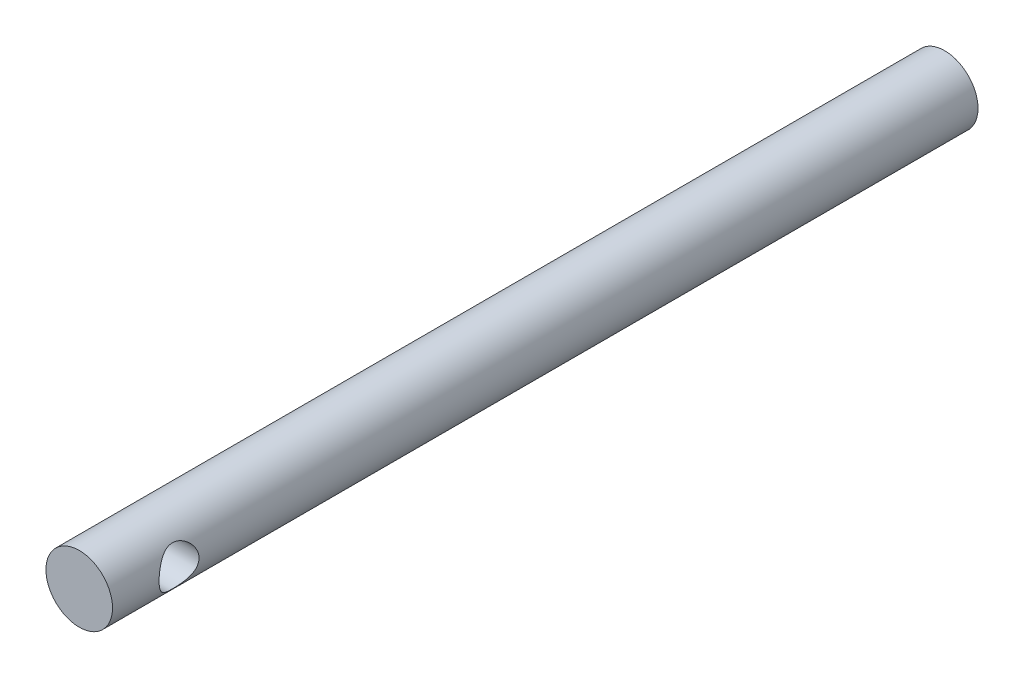
ISO-10303-21;
HEADER;
FILE_DESCRIPTION(('STEP AP214'),'2;1');
FILE_NAME('part.step','',(''),(''),'','','');
FILE_SCHEMA(('AUTOMOTIVE_DESIGN { 1 0 10303 214 1 1 1 1 }'));
ENDSEC;
DATA;
#1=APPLICATION_CONTEXT('core data for automotive mechanical design processes');
#2=APPLICATION_PROTOCOL_DEFINITION('international standard','automotive_design',2000,#1);
#3=PRODUCT_CONTEXT('',#1,'mechanical');
#4=PRODUCT('Part','Part','',(#3));
#5=PRODUCT_RELATED_PRODUCT_CATEGORY('part','',(#4));
#6=PRODUCT_DEFINITION_FORMATION('','',#4);
#7=PRODUCT_DEFINITION_CONTEXT('part definition',#1,'design');
#8=PRODUCT_DEFINITION('design','',#6,#7);
#9=PRODUCT_DEFINITION_SHAPE('','',#8);
#10=(LENGTH_UNIT() NAMED_UNIT(*) SI_UNIT(.MILLI.,.METRE.));
#11=(NAMED_UNIT(*) PLANE_ANGLE_UNIT() SI_UNIT($,.RADIAN.));
#12=(NAMED_UNIT(*) SI_UNIT($,.STERADIAN.) SOLID_ANGLE_UNIT());
#13=UNCERTAINTY_MEASURE_WITH_UNIT(LENGTH_MEASURE(1.E-05),#10,'distance_accuracy_value','');
#14=(GEOMETRIC_REPRESENTATION_CONTEXT(3) GLOBAL_UNCERTAINTY_ASSIGNED_CONTEXT((#13)) GLOBAL_UNIT_ASSIGNED_CONTEXT((#10,
#11,#12)) REPRESENTATION_CONTEXT('',''));
#15=CARTESIAN_POINT('',(0.,0.,0.));
#16=DIRECTION('',(0.,0.,1.));
#17=DIRECTION('',(1.,0.,0.));
#18=AXIS2_PLACEMENT_3D('',#15,#16,#17);
#19=CARTESIAN_POINT('',(0.,0.,-130.));
#20=DIRECTION('',(0.,0.,1.));
#21=DIRECTION('',(1.,0.,0.));
#22=AXIS2_PLACEMENT_3D('',#19,#20,#21);
#23=CYLINDRICAL_SURFACE('',#22,5.);
#24=CARTESIAN_POINT('',(-5.,0.,-13.));
#25=CARTESIAN_POINT('',(-4.99999907546385,-0.0767697294351699,-12.9999989437555));
#26=CARTESIAN_POINT('',(-4.99822567812271,-0.153562134518386,-12.9970464064299));
#27=CARTESIAN_POINT('',(-4.99118362570631,-0.306548487758714,-12.9852857670203));
#28=CARTESIAN_POINT('',(-4.98591292553957,-0.382742059346592,-12.9764742388118));
#29=CARTESIAN_POINT('',(-4.96499345352549,-0.609808130024626,-12.9413514405369));
#30=CARTESIAN_POINT('',(-4.94423772571335,-0.758981863291666,-12.9063522975666));
#31=CARTESIAN_POINT('',(-4.89123238995897,-1.04754167363585,-12.8152272564959));
#32=CARTESIAN_POINT('',(-4.8590397955111,-1.18697226741342,-12.7592060779873));
#33=CARTESIAN_POINT('',(-4.7859070225578,-1.45405042800218,-12.628279339403));
#34=CARTESIAN_POINT('',(-4.74496901614699,-1.58170090938261,-12.5533784676398));
#35=CARTESIAN_POINT('',(-4.65410731283371,-1.83260160381823,-12.3804503448849));
#36=CARTESIAN_POINT('',(-4.60373587041895,-1.95476885986166,-12.2810926088335));
#37=CARTESIAN_POINT('',(-4.50060875905921,-2.18176458748059,-12.0650655928078));
#38=CARTESIAN_POINT('',(-4.4478500955754,-2.28657046750403,-11.9483741257817));
#39=CARTESIAN_POINT('',(-4.33822134833335,-2.48890019509837,-11.6841529788311));
#40=CARTESIAN_POINT('',(-4.28164035635797,-2.5839553962784,-11.5345964578778));
#41=CARTESIAN_POINT('',(-4.17876602596121,-2.74722868670786,-11.2183068536731));
#42=CARTESIAN_POINT('',(-4.13245604474886,-2.8154903315581,-11.0516022079668));
#43=CARTESIAN_POINT('',(-4.06709259377223,-2.90881204577224,-10.7468070983431));
#44=CARTESIAN_POINT('',(-4.04415766338645,-2.94032394587637,-10.6115280016386));
#45=CARTESIAN_POINT('',(-4.01180616527622,-2.98432344587083,-10.3363925694786));
#46=CARTESIAN_POINT('',(-4.00237279089368,-2.99683469884358,-10.196542146696));
#47=CARTESIAN_POINT('',(-3.99841845126251,-3.0021101681982,-9.91597700735214));
#48=CARTESIAN_POINT('',(-4.00392674756739,-2.99483563630785,-9.77526113408813));
#49=CARTESIAN_POINT('',(-4.02906522155629,-2.96092124146105,-9.49744246488214));
#50=CARTESIAN_POINT('',(-4.04870602134773,-2.93426681225441,-9.36034246705851));
#51=CARTESIAN_POINT('',(-4.09906376582929,-2.86347831933193,-9.09493945774946));
#52=CARTESIAN_POINT('',(-4.12963433300037,-2.8195745342289,-8.96654567700555));
#53=CARTESIAN_POINT('',(-4.19854092703026,-2.71590167467071,-8.7186102333682));
#54=CARTESIAN_POINT('',(-4.2368797994146,-2.65612678414159,-8.59907183617098));
#55=CARTESIAN_POINT('',(-4.32510698365561,-2.51035773820671,-8.35003086234366));
#56=CARTESIAN_POINT('',(-4.3758426358075,-2.42160671901867,-8.22244000763227));
#57=CARTESIAN_POINT('',(-4.4786102252415,-2.22582963207776,-7.98265084277989));
#58=CARTESIAN_POINT('',(-4.53064336077653,-2.11878609335504,-7.87046743459787));
#59=CARTESIAN_POINT('',(-4.63871766962913,-1.87159040921357,-7.64875774055151));
#60=CARTESIAN_POINT('',(-4.69430681953073,-1.72890315178768,-7.54178060876265));
#61=CARTESIAN_POINT('',(-4.77018325995047,-1.50061053630278,-7.40073128727714));
#62=CARTESIAN_POINT('',(-4.79423315237467,-1.42209821815681,-7.3569358644839));
#63=CARTESIAN_POINT('',(-4.83916496756429,-1.26074368673913,-7.276281176389));
#64=CARTESIAN_POINT('',(-4.86004883588963,-1.17790417501176,-7.2394176479792));
#65=CARTESIAN_POINT('',(-4.8968267274493,-1.01376371174001,-7.17518855714337));
#66=CARTESIAN_POINT('',(-4.91295100454953,-0.932690066663958,-7.14737343955079));
#67=CARTESIAN_POINT('',(-4.94139126794745,-0.767879949732827,-7.09866604415477));
#68=CARTESIAN_POINT('',(-4.95370938553284,-0.684144997174638,-7.07776989155364));
#69=CARTESIAN_POINT('',(-4.97416370514887,-0.514744462654423,-7.04322814527524));
#70=CARTESIAN_POINT('',(-4.98230296820872,-0.42908034196961,-7.02957724417139));
#71=CARTESIAN_POINT('',(-4.99415996414414,-0.256621746592206,-7.0097338156098));
#72=CARTESIAN_POINT('',(-4.99787831889699,-0.169827432617759,-7.00354023914868));
#73=CARTESIAN_POINT('',(-5.00179157954795,0.0673242571106421,-6.99700732971637));
#74=CARTESIAN_POINT('',(-4.99746512571837,0.21805684261066,-7.0041884543694));
#75=CARTESIAN_POINT('',(-4.97557955020067,0.515686907628996,-7.0408455417291));
#76=CARTESIAN_POINT('',(-4.95802069684413,0.662584464852965,-7.07032105234186));
#77=CARTESIAN_POINT('',(-4.91189447655688,0.945142599254813,-7.14908845918428));
#78=CARTESIAN_POINT('',(-4.88360514429733,1.08098954856944,-7.19788112659201));
#79=CARTESIAN_POINT('',(-4.81827798628348,1.34253345184752,-7.31335432420091));
#80=CARTESIAN_POINT('',(-4.78123843515362,1.46822839746276,-7.38003838259407));
#81=CARTESIAN_POINT('',(-4.69690981059278,1.7200119213015,-7.53711409097797));
#82=CARTESIAN_POINT('',(-4.6489560240695,1.84478813824221,-7.62924769383748));
#83=CARTESIAN_POINT('',(-4.54948534225871,2.07805222548222,-7.83078275125476));
#84=CARTESIAN_POINT('',(-4.49796434043363,2.18652085154156,-7.94020429960271));
#85=CARTESIAN_POINT('',(-4.38890846835682,2.39863988264158,-8.18982079149316));
#86=CARTESIAN_POINT('',(-4.33146483230154,2.49982037884172,-8.33216777394304));
#87=CARTESIAN_POINT('',(-4.22432364395571,2.67690479207535,-8.63443204612756));
#88=CARTESIAN_POINT('',(-4.1746179606141,2.75283533845462,-8.79433058715125));
#89=CARTESIAN_POINT('',(-4.09969818429266,2.86285157351706,-9.09248604511072));
#90=CARTESIAN_POINT('',(-4.07151318633887,2.90243250662613,-9.22796062464204));
#91=CARTESIAN_POINT('',(-4.02819211510624,2.96227327821697,-9.50506415623523));
#92=CARTESIAN_POINT('',(-4.01303795327895,2.98255990395067,-9.64668428945152));
#93=CARTESIAN_POINT('',(-3.99800893189922,3.00268261034206,-9.93275389439521));
#94=CARTESIAN_POINT('',(-3.99819152744817,3.00244179030845,-10.0772119782483));
#95=CARTESIAN_POINT('',(-4.01395435932838,2.98132945103105,-10.3637888743464));
#96=CARTESIAN_POINT('',(-4.02954296823692,2.96044671369591,-10.5059063718748));
#97=CARTESIAN_POINT('',(-4.07266369966216,2.90080351212233,-10.7769768239951));
#98=CARTESIAN_POINT('',(-4.09958421715569,2.86295284328648,-10.9062341479244));
#99=CARTESIAN_POINT('',(-4.16211005816609,2.77126473512031,-11.1566745496532));
#100=CARTESIAN_POINT('',(-4.19771865147484,2.7174212751772,-11.277854565613));
#101=CARTESIAN_POINT('',(-4.28025972950371,2.58578536859698,-11.52863953946));
#102=CARTESIAN_POINT('',(-4.32809142579694,2.50558518231556,-11.6566815082148));
#103=CARTESIAN_POINT('',(-4.42640286674054,2.32751213746958,-11.8987608453066));
#104=CARTESIAN_POINT('',(-4.47688476749087,2.22962472612067,-12.0127865504795));
#105=CARTESIAN_POINT('',(-4.5845123827036,2.00020353552556,-12.2426988433295));
#106=CARTESIAN_POINT('',(-4.64140045738634,1.86578571790514,-12.3558498798616));
#107=CARTESIAN_POINT('',(-4.74731429537958,1.57689277813436,-12.5582079860481));
#108=CARTESIAN_POINT('',(-4.79633723789531,1.42241049573676,-12.6474064729197));
#109=CARTESIAN_POINT('',(-4.85920558314903,1.18102189661686,-12.7591244741905));
#110=CARTESIAN_POINT('',(-4.87817139185349,1.10025014285136,-12.7923359959645));
#111=CARTESIAN_POINT('',(-4.91243413775203,0.935442217988393,-12.8517721381435));
#112=CARTESIAN_POINT('',(-4.9277332153652,0.851407984788106,-12.8780008357009));
#113=CARTESIAN_POINT('',(-4.95415527987996,0.68100181607457,-12.9230094420757));
#114=CARTESIAN_POINT('',(-4.9652904423195,0.594637500609297,-12.9418110773033));
#115=CARTESIAN_POINT('',(-4.98308318645253,0.420183746020765,-12.971744355323));
#116=CARTESIAN_POINT('',(-4.98974449723791,0.332095806784399,-12.9828823861533));
#117=CARTESIAN_POINT('',(-4.99603728421477,0.203123929661338,-12.9933916838053));
#118=CARTESIAN_POINT('',(-4.99752198179196,0.162556281113488,-12.995868430454));
#119=CARTESIAN_POINT('',(-4.99950360169341,0.081327878186767,-12.9991728969139));
#120=CARTESIAN_POINT('',(-5.00000048975323,0.0406671206271717,-13.0000005595229));
#121=CARTESIAN_POINT('',(-5.,0.,-13.));
#122=B_SPLINE_CURVE_WITH_KNOTS('',3,(#24,#25,#26,#27,#28,#29,#30,#31,#32,#33,#34,#35,#36,#37,
#38,#39,#40,#41,#42,#43,#44,#45,#46,#47,#48,#49,#50,#51,#52,#53,#54,#55,#56,#57,#58,#59,#60,#61,
#62,#63,#64,#65,#66,#67,#68,#69,#70,#71,#72,#73,#74,#75,#76,#77,#78,#79,#80,#81,#82,#83,#84,#85,
#86,#87,#88,#89,#90,#91,#92,#93,#94,#95,#96,#97,#98,#99,#100,#101,#102,#103,#104,#105,#106,#107,
#108,#109,#110,#111,#112,#113,#114,#115,#116,#117,#118,#119,#120,#121),.UNSPECIFIED.,.T.,.F.,(4,
2,2,2,2,2,2,2,2,2,2,2,2,2,2,2,2,2,2,2,2,2,2,2,2,2,2,2,2,2,2,2,2,2,2,2,2,2,2,2,2,2,2,2,2,2,2,2,
4),(0.,0.230263300595002,0.4606613693334,0.922002149276125,1.38107466343613,1.84003329022065,
2.33408870888555,2.82878205293211,3.38413315803225,3.93857770807794,4.35913349134877,
4.77916531256766,5.20002031165062,5.62119195971355,6.03692224610024,6.45280509043347,
6.94139679873935,7.43045779030958,7.98767605192992,8.26653157143431,8.54521503013734,
8.80648473589063,9.06760787545943,9.3285394673096,9.58943435026958,10.0398406663534,
10.490237849174,10.9296843257003,11.3692175250854,11.8543559282721,12.3400624135416,
12.889063860465,13.437484464234,13.8674843581987,14.2968863865712,14.7278971274535,
15.1591422350194,15.5696105785277,15.9802336423656,16.4539008129506,16.927959499309,
17.4794148474152,18.0310675325445,18.2988384573895,18.5664526907294,18.8332781687618,
19.0998809626714,19.221853785686,19.3438308395353),.UNSPECIFIED.);
#123=CARTESIAN_POINT('',(-5.,0.,-13.));
#124=VERTEX_POINT('',#123);
#125=EDGE_CURVE('E8',#124,#124,#122,.F.);
#126=ORIENTED_EDGE('',*,*,#125,.T.);
#127=EDGE_LOOP('',(#126));
#128=FACE_BOUND('',#127,.T.);
#129=CARTESIAN_POINT('',(0.,0.,-130.));
#130=DIRECTION('',(0.,0.,1.));
#131=DIRECTION('',(1.,0.,0.));
#132=AXIS2_PLACEMENT_3D('',#129,#130,#131);
#133=CIRCLE('',#132,5.);
#134=CARTESIAN_POINT('',(5.,0.,-130.));
#135=VERTEX_POINT('',#134);
#136=EDGE_CURVE('E21',#135,#135,#133,.T.);
#137=ORIENTED_EDGE('',*,*,#136,.T.);
#138=EDGE_LOOP('',(#137));
#139=FACE_BOUND('',#138,.T.);
#140=CARTESIAN_POINT('',(0.,0.,0.));
#141=DIRECTION('',(0.,0.,1.));
#142=DIRECTION('',(1.,0.,0.));
#143=AXIS2_PLACEMENT_3D('',#140,#141,#142);
#144=CIRCLE('',#143,5.);
#145=CARTESIAN_POINT('',(5.,0.,0.));
#146=VERTEX_POINT('',#145);
#147=EDGE_CURVE('E17',#146,#146,#144,.T.);
#148=ORIENTED_EDGE('',*,*,#147,.F.);
#149=EDGE_LOOP('',(#148));
#150=FACE_BOUND('',#149,.T.);
#151=CARTESIAN_POINT('',(5.,0.,-7.));
#152=CARTESIAN_POINT('',(4.99999907546385,-0.0767697294351717,-7.00000105624454));
#153=CARTESIAN_POINT('',(4.99822567812271,-0.153562134518388,-7.00295359357007));
#154=CARTESIAN_POINT('',(4.99118362570631,-0.306548487758716,-7.01471423297974));
#155=CARTESIAN_POINT('',(4.98591292553957,-0.382742059346594,-7.02352576118823));
#156=CARTESIAN_POINT('',(4.96499345352549,-0.609808130024628,-7.05864855946313));
#157=CARTESIAN_POINT('',(4.94423772571335,-0.758981863291668,-7.09364770243344));
#158=CARTESIAN_POINT('',(4.89123238995897,-1.04754167363585,-7.18477274350412));
#159=CARTESIAN_POINT('',(4.8590397955111,-1.18697226741342,-7.24079392201274));
#160=CARTESIAN_POINT('',(4.7859070225578,-1.45405042800218,-7.37172066059704));
#161=CARTESIAN_POINT('',(4.74496901614699,-1.58170090938261,-7.44662153236016));
#162=CARTESIAN_POINT('',(4.65410731283371,-1.83260160381823,-7.61954965511512));
#163=CARTESIAN_POINT('',(4.60373587041895,-1.95476885986166,-7.71890739116654));
#164=CARTESIAN_POINT('',(4.50060875905921,-2.1817645874806,-7.93493440719219));
#165=CARTESIAN_POINT('',(4.4478500955754,-2.28657046750404,-8.05162587421835));
#166=CARTESIAN_POINT('',(4.33822134833335,-2.48890019509838,-8.31584702116891));
#167=CARTESIAN_POINT('',(4.28164035635797,-2.5839553962784,-8.46540354212218));
#168=CARTESIAN_POINT('',(4.17876602596121,-2.74722868670786,-8.78169314632689));
#169=CARTESIAN_POINT('',(4.13245604474886,-2.8154903315581,-8.94839779203316));
#170=CARTESIAN_POINT('',(4.06709259377223,-2.90881204577224,-9.2531929016569));
#171=CARTESIAN_POINT('',(4.04415766338645,-2.94032394587637,-9.38847199836139));
#172=CARTESIAN_POINT('',(4.01180616527622,-2.98432344587083,-9.6636074305214));
#173=CARTESIAN_POINT('',(4.00237279089368,-2.99683469884359,-9.80345785330404));
#174=CARTESIAN_POINT('',(3.99841845126251,-3.0021101681982,-10.0840229926479));
#175=CARTESIAN_POINT('',(4.00392674756739,-2.99483563630785,-10.2247388659119));
#176=CARTESIAN_POINT('',(4.02906522155629,-2.96092124146105,-10.5025575351179));
#177=CARTESIAN_POINT('',(4.04870602134773,-2.93426681225441,-10.6396575329415));
#178=CARTESIAN_POINT('',(4.09906376582929,-2.86347831933193,-10.9050605422505));
#179=CARTESIAN_POINT('',(4.12963433300037,-2.8195745342289,-11.0334543229945));
#180=CARTESIAN_POINT('',(4.19854092703026,-2.7159016746707,-11.2813897666318));
#181=CARTESIAN_POINT('',(4.2368797994146,-2.65612678414159,-11.400928163829));
#182=CARTESIAN_POINT('',(4.32510698365562,-2.5103577382067,-11.6499691376563));
#183=CARTESIAN_POINT('',(4.3758426358075,-2.42160671901867,-11.7775599923677));
#184=CARTESIAN_POINT('',(4.4786102252415,-2.22582963207776,-12.0173491572201));
#185=CARTESIAN_POINT('',(4.53064336077654,-2.11878609335503,-12.1295325654021));
#186=CARTESIAN_POINT('',(4.63871766962914,-1.87159040921356,-12.3512422594485));
#187=CARTESIAN_POINT('',(4.69430681953073,-1.72890315178768,-12.4582193912374));
#188=CARTESIAN_POINT('',(4.77018325995047,-1.50061053630278,-12.5992687127229));
#189=CARTESIAN_POINT('',(4.79423315237468,-1.42209821815681,-12.6430641355161));
#190=CARTESIAN_POINT('',(4.83916496756429,-1.26074368673913,-12.723718823611));
#191=CARTESIAN_POINT('',(4.86004883588963,-1.17790417501175,-12.7605823520208));
#192=CARTESIAN_POINT('',(4.8968267274493,-1.01376371174,-12.8248114428566));
#193=CARTESIAN_POINT('',(4.91295100454953,-0.932690066663953,-12.8526265604492));
#194=CARTESIAN_POINT('',(4.94139126794745,-0.767879949732822,-12.9013339558452));
#195=CARTESIAN_POINT('',(4.95370938553284,-0.684144997174633,-12.9222301084464));
#196=CARTESIAN_POINT('',(4.97416370514887,-0.514744462654419,-12.9567718547248));
#197=CARTESIAN_POINT('',(4.98230296820872,-0.429080341969606,-12.9704227558286));
#198=CARTESIAN_POINT('',(4.99415996414414,-0.256621746592202,-12.9902661843902));
#199=CARTESIAN_POINT('',(4.99787831889699,-0.169827432617754,-12.9964597608513));
#200=CARTESIAN_POINT('',(5.00179157954795,0.067324257110647,-13.0029926702836));
#201=CARTESIAN_POINT('',(4.99746512571837,0.218056842610665,-12.9958115456306));
#202=CARTESIAN_POINT('',(4.97557955020067,0.515686907629001,-12.9591544582709));
#203=CARTESIAN_POINT('',(4.95802069684413,0.66258446485297,-12.9296789476581));
#204=CARTESIAN_POINT('',(4.91189447655688,0.945142599254817,-12.8509115408157));
#205=CARTESIAN_POINT('',(4.88360514429733,1.08098954856944,-12.802118873408));
#206=CARTESIAN_POINT('',(4.81827798628348,1.34253345184753,-12.6866456757991));
#207=CARTESIAN_POINT('',(4.78123843515362,1.46822839746276,-12.6199616174059));
#208=CARTESIAN_POINT('',(4.69690981059277,1.72001192130151,-12.462885909022));
#209=CARTESIAN_POINT('',(4.6489560240695,1.84478813824221,-12.3707523061625));
#210=CARTESIAN_POINT('',(4.54948534225871,2.07805222548222,-12.1692172487452));
#211=CARTESIAN_POINT('',(4.49796434043363,2.18652085154156,-12.0597957003973));
#212=CARTESIAN_POINT('',(4.38890846835682,2.39863988264158,-11.8101792085068));
#213=CARTESIAN_POINT('',(4.33146483230154,2.49982037884172,-11.667832226057));
#214=CARTESIAN_POINT('',(4.2243236439557,2.67690479207535,-11.3655679538724));
#215=CARTESIAN_POINT('',(4.1746179606141,2.75283533845462,-11.2056694128487));
#216=CARTESIAN_POINT('',(4.09969818429266,2.86285157351706,-10.9075139548893));
#217=CARTESIAN_POINT('',(4.07151318633887,2.90243250662613,-10.772039375358));
#218=CARTESIAN_POINT('',(4.02819211510624,2.96227327821697,-10.4949358437648));
#219=CARTESIAN_POINT('',(4.01303795327895,2.98255990395067,-10.3533157105485));
#220=CARTESIAN_POINT('',(3.99800893189922,3.00268261034206,-10.0672461056048));
#221=CARTESIAN_POINT('',(3.99819152744816,3.00244179030845,-9.92278802175169));
#222=CARTESIAN_POINT('',(4.01395435932838,2.98132945103105,-9.6362111256536));
#223=CARTESIAN_POINT('',(4.02954296823692,2.96044671369591,-9.49409362812519));
#224=CARTESIAN_POINT('',(4.07266369966217,2.90080351212233,-9.2230231760049));
#225=CARTESIAN_POINT('',(4.09958421715569,2.86295284328648,-9.09376585207564));
#226=CARTESIAN_POINT('',(4.16211005816609,2.77126473512031,-8.84332545034685));
#227=CARTESIAN_POINT('',(4.19771865147484,2.7174212751772,-8.722145434387));
#228=CARTESIAN_POINT('',(4.28025972950371,2.58578536859697,-8.47136046054001));
#229=CARTESIAN_POINT('',(4.32809142579694,2.50558518231556,-8.34331849178523));
#230=CARTESIAN_POINT('',(4.42640286674054,2.32751213746957,-8.1012391546934));
#231=CARTESIAN_POINT('',(4.47688476749088,2.22962472612067,-7.98721344952045));
#232=CARTESIAN_POINT('',(4.5845123827036,2.00020353552555,-7.75730115667053));
#233=CARTESIAN_POINT('',(4.64140045738634,1.86578571790513,-7.64415012013839));
#234=CARTESIAN_POINT('',(4.74731429537958,1.57689277813435,-7.44179201395186));
#235=CARTESIAN_POINT('',(4.79633723789531,1.42241049573675,-7.35259352708029));
#236=CARTESIAN_POINT('',(4.85920558314903,1.18102189661685,-7.24087552580947));
#237=CARTESIAN_POINT('',(4.87817139185349,1.10025014285135,-7.2076640040355));
#238=CARTESIAN_POINT('',(4.91243413775203,0.935442217988379,-7.14822786185654));
#239=CARTESIAN_POINT('',(4.9277332153652,0.851407984788093,-7.12199916429906));
#240=CARTESIAN_POINT('',(4.95415527987996,0.681001816074558,-7.07699055792425));
#241=CARTESIAN_POINT('',(4.9652904423195,0.594637500609285,-7.0581889226967));
#242=CARTESIAN_POINT('',(4.98308318645254,0.420183746020755,-7.02825564467701));
#243=CARTESIAN_POINT('',(4.98974449723791,0.33209580678439,-7.01711761384669));
#244=CARTESIAN_POINT('',(4.99603728421477,0.203123929661331,-7.00660831619467));
#245=CARTESIAN_POINT('',(4.99752198179196,0.162556281113482,-7.004131569546));
#246=CARTESIAN_POINT('',(4.99950360169341,0.0813278781867631,-7.00082710308606));
#247=CARTESIAN_POINT('',(5.00000048975323,0.0406671206271689,-6.99999944047707));
#248=CARTESIAN_POINT('',(5.,0.,-7.));
#249=B_SPLINE_CURVE_WITH_KNOTS('',3,(#151,#152,#153,#154,#155,#156,#157,#158,#159,#160,#161,
#162,#163,#164,#165,#166,#167,#168,#169,#170,#171,#172,#173,#174,#175,#176,#177,#178,#179,#180,
#181,#182,#183,#184,#185,#186,#187,#188,#189,#190,#191,#192,#193,#194,#195,#196,#197,#198,#199,
#200,#201,#202,#203,#204,#205,#206,#207,#208,#209,#210,#211,#212,#213,#214,#215,#216,#217,#218,
#219,#220,#221,#222,#223,#224,#225,#226,#227,#228,#229,#230,#231,#232,#233,#234,#235,#236,#237,
#238,#239,#240,#241,#242,#243,#244,#245,#246,#247,#248),.UNSPECIFIED.,.T.,.F.,(4,2,2,2,2,2,2,2,
2,2,2,2,2,2,2,2,2,2,2,2,2,2,2,2,2,2,2,2,2,2,2,2,2,2,2,2,2,2,2,2,2,2,2,2,2,2,2,2,4),(0.,
0.230263300595003,0.4606613693334,0.922002149276126,1.38107466343612,1.84003329022065,
2.33408870888555,2.82878205293211,3.38413315803225,3.93857770807793,4.35913349134877,
4.77916531256766,5.20002031165062,5.62119195971355,6.03692224610024,6.45280509043347,
6.94139679873935,7.43045779030958,7.98767605192992,8.26653157143431,8.54521503013734,
8.80648473589063,9.06760787545943,9.3285394673096,9.58943435026958,10.0398406663534,
10.490237849174,10.9296843257003,11.3692175250854,11.8543559282721,12.3400624135416,
12.889063860465,13.437484464234,13.8674843581987,14.2968863865712,14.7278971274535,
15.1591422350194,15.5696105785277,15.9802336423656,16.4539008129506,16.927959499309,
17.4794148474152,18.0310675325446,18.2988384573895,18.5664526907294,18.8332781687618,
19.0998809626714,19.221853785686,19.3438308395353),.UNSPECIFIED.);
#250=CARTESIAN_POINT('',(5.,0.,-7.));
#251=VERTEX_POINT('',#250);
#252=EDGE_CURVE('E26',#251,#251,#249,.F.);
#253=ORIENTED_EDGE('',*,*,#252,.T.);
#254=EDGE_LOOP('',(#253));
#255=FACE_BOUND('',#254,.T.);
#256=ADVANCED_FACE('F13',(#128,#139,#150,#255),#23,.T.);
#257=CARTESIAN_POINT('',(0.,0.,-130.));
#258=DIRECTION('',(0.,0.,1.));
#259=DIRECTION('',(1.,0.,0.));
#260=AXIS2_PLACEMENT_3D('',#257,#258,#259);
#261=PLANE('',#260);
#262=ORIENTED_EDGE('',*,*,#136,.F.);
#263=EDGE_LOOP('',(#262));
#264=FACE_BOUND('',#263,.T.);
#265=ADVANCED_FACE('F48',(#264),#261,.F.);
#266=CARTESIAN_POINT('',(0.,0.,0.));
#267=DIRECTION('',(0.,0.,1.));
#268=DIRECTION('',(1.,0.,0.));
#269=AXIS2_PLACEMENT_3D('',#266,#267,#268);
#270=PLANE('',#269);
#271=ORIENTED_EDGE('',*,*,#147,.T.);
#272=EDGE_LOOP('',(#271));
#273=FACE_BOUND('',#272,.T.);
#274=ADVANCED_FACE('F34',(#273),#270,.T.);
#275=CARTESIAN_POINT('',(100.,0.,-10.));
#276=DIRECTION('',(-1.,0.,0.));
#277=DIRECTION('',(0.,0.,1.));
#278=AXIS2_PLACEMENT_3D('',#275,#276,#277);
#279=CYLINDRICAL_SURFACE('',#278,3.);
#280=ORIENTED_EDGE('',*,*,#252,.F.);
#281=EDGE_LOOP('',(#280));
#282=FACE_BOUND('',#281,.T.);
#283=ORIENTED_EDGE('',*,*,#125,.F.);
#284=EDGE_LOOP('',(#283));
#285=FACE_BOUND('',#284,.T.);
#286=ADVANCED_FACE('F30',(#282,#285),#279,.F.);
#287=CLOSED_SHELL('',(#256,#265,#274,#286));
#288=MANIFOLD_SOLID_BREP('B1',#287);
#289=ADVANCED_BREP_SHAPE_REPRESENTATION('',(#18,#288),#14);
#290=SHAPE_DEFINITION_REPRESENTATION(#9,#289);
ENDSEC;
END-ISO-10303-21;
